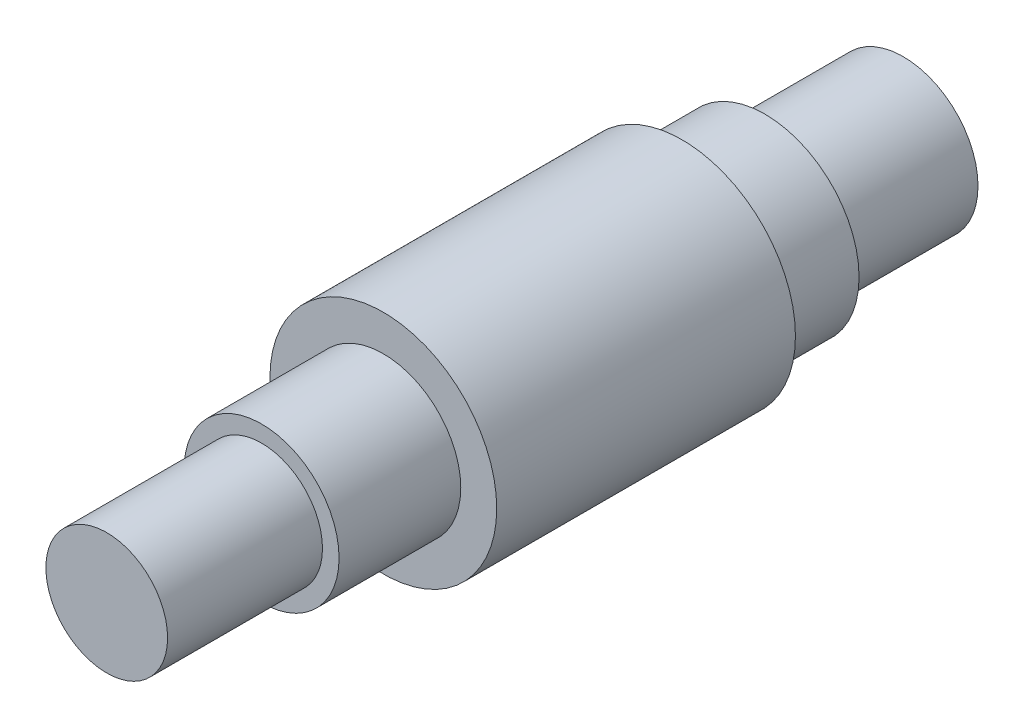
ISO-10303-21;
HEADER;
FILE_DESCRIPTION(('STEP AP214'),'2;1');
FILE_NAME('part.step','',(''),(''),'','','');
FILE_SCHEMA(('AUTOMOTIVE_DESIGN { 1 0 10303 214 1 1 1 1 }'));
ENDSEC;
DATA;
#1=APPLICATION_CONTEXT('core data for automotive mechanical design processes');
#2=APPLICATION_PROTOCOL_DEFINITION('international standard','automotive_design',2000,#1);
#3=PRODUCT_CONTEXT('',#1,'mechanical');
#4=PRODUCT('Part','Part','',(#3));
#5=PRODUCT_RELATED_PRODUCT_CATEGORY('part','',(#4));
#6=PRODUCT_DEFINITION_FORMATION('','',#4);
#7=PRODUCT_DEFINITION_CONTEXT('part definition',#1,'design');
#8=PRODUCT_DEFINITION('design','',#6,#7);
#9=PRODUCT_DEFINITION_SHAPE('','',#8);
#10=(LENGTH_UNIT() NAMED_UNIT(*) SI_UNIT(.MILLI.,.METRE.));
#11=(NAMED_UNIT(*) PLANE_ANGLE_UNIT() SI_UNIT($,.RADIAN.));
#12=(NAMED_UNIT(*) SI_UNIT($,.STERADIAN.) SOLID_ANGLE_UNIT());
#13=UNCERTAINTY_MEASURE_WITH_UNIT(LENGTH_MEASURE(1.E-05),#10,'distance_accuracy_value','');
#14=(GEOMETRIC_REPRESENTATION_CONTEXT(3) GLOBAL_UNCERTAINTY_ASSIGNED_CONTEXT((#13)) GLOBAL_UNIT_ASSIGNED_CONTEXT((#10,
#11,#12)) REPRESENTATION_CONTEXT('',''));
#15=CARTESIAN_POINT('',(0.,0.,0.));
#16=DIRECTION('',(0.,0.,1.));
#17=DIRECTION('',(1.,0.,0.));
#18=AXIS2_PLACEMENT_3D('',#15,#16,#17);
#19=CARTESIAN_POINT('',(0.,0.,-25.));
#20=DIRECTION('',(0.,0.,1.));
#21=DIRECTION('',(1.,0.,0.));
#22=AXIS2_PLACEMENT_3D('',#19,#20,#21);
#23=CYLINDRICAL_SURFACE('',#22,5.5);
#24=CARTESIAN_POINT('',(0.,0.,-14.));
#25=DIRECTION('',(0.,0.,1.));
#26=DIRECTION('',(1.,0.,0.));
#27=AXIS2_PLACEMENT_3D('',#24,#25,#26);
#28=CIRCLE('',#27,5.5);
#29=CARTESIAN_POINT('',(5.5,0.,-14.));
#30=VERTEX_POINT('',#29);
#31=EDGE_CURVE('E68',#30,#30,#28,.T.);
#32=ORIENTED_EDGE('',*,*,#31,.T.);
#33=EDGE_LOOP('',(#32));
#34=FACE_BOUND('',#33,.T.);
#35=CARTESIAN_POINT('',(0.,0.,0.));
#36=DIRECTION('',(0.,0.,1.));
#37=DIRECTION('',(1.,0.,0.));
#38=AXIS2_PLACEMENT_3D('',#35,#36,#37);
#39=CIRCLE('',#38,5.5);
#40=CARTESIAN_POINT('',(5.5,0.,0.));
#41=VERTEX_POINT('',#40);
#42=EDGE_CURVE('E71',#41,#41,#39,.T.);
#43=ORIENTED_EDGE('',*,*,#42,.F.);
#44=EDGE_LOOP('',(#43));
#45=FACE_BOUND('',#44,.T.);
#46=ADVANCED_FACE('F36',(#34,#45),#23,.T.);
#47=CARTESIAN_POINT('',(0.,0.,0.));
#48=DIRECTION('',(0.,0.,1.));
#49=DIRECTION('',(1.,0.,0.));
#50=AXIS2_PLACEMENT_3D('',#47,#48,#49);
#51=PLANE('',#50);
#52=ORIENTED_EDGE('',*,*,#42,.T.);
#53=EDGE_LOOP('',(#52));
#54=FACE_BOUND('',#53,.T.);
#55=ADVANCED_FACE('F75',(#54),#51,.T.);
#56=CARTESIAN_POINT('',(0.,0.,-72.));
#57=DIRECTION('',(0.,0.,1.));
#58=DIRECTION('',(1.,0.,0.));
#59=AXIS2_PLACEMENT_3D('',#56,#57,#58);
#60=PLANE('',#59);
#61=CARTESIAN_POINT('',(0.,0.,-72.));
#62=DIRECTION('',(0.,0.,1.));
#63=DIRECTION('',(1.,0.,0.));
#64=AXIS2_PLACEMENT_3D('',#61,#62,#63);
#65=CIRCLE('',#64,6.75);
#66=CARTESIAN_POINT('',(6.75,0.,-72.));
#67=VERTEX_POINT('',#66);
#68=EDGE_CURVE('E10',#67,#67,#65,.T.);
#69=ORIENTED_EDGE('',*,*,#68,.F.);
#70=EDGE_LOOP('',(#69));
#71=FACE_BOUND('',#70,.T.);
#72=ADVANCED_FACE('F38',(#71),#60,.F.);
#73=CARTESIAN_POINT('',(0.,0.,-25.));
#74=DIRECTION('',(0.,0.,1.));
#75=DIRECTION('',(1.,0.,0.));
#76=AXIS2_PLACEMENT_3D('',#73,#74,#75);
#77=CYLINDRICAL_SURFACE('',#76,6.75);
#78=ORIENTED_EDGE('',*,*,#68,.T.);
#79=EDGE_LOOP('',(#78));
#80=FACE_BOUND('',#79,.T.);
#81=CARTESIAN_POINT('',(0.,0.,-59.5));
#82=DIRECTION('',(0.,0.,1.));
#83=DIRECTION('',(1.,0.,0.));
#84=AXIS2_PLACEMENT_3D('',#81,#82,#83);
#85=CIRCLE('',#84,6.75);
#86=CARTESIAN_POINT('',(6.75,0.,-59.5));
#87=VERTEX_POINT('',#86);
#88=EDGE_CURVE('E43',#87,#87,#85,.T.);
#89=ORIENTED_EDGE('',*,*,#88,.F.);
#90=EDGE_LOOP('',(#89));
#91=FACE_BOUND('',#90,.T.);
#92=ADVANCED_FACE('F86',(#80,#91),#77,.T.);
#93=CARTESIAN_POINT('',(0.,0.,-59.5));
#94=DIRECTION('',(0.,0.,1.));
#95=DIRECTION('',(1.,0.,0.));
#96=AXIS2_PLACEMENT_3D('',#93,#94,#95);
#97=PLANE('',#96);
#98=CARTESIAN_POINT('',(0.,0.,-59.5));
#99=DIRECTION('',(0.,0.,1.));
#100=DIRECTION('',(1.,0.,0.));
#101=AXIS2_PLACEMENT_3D('',#98,#99,#100);
#102=CIRCLE('',#101,8.5);
#103=CARTESIAN_POINT('',(8.5,0.,-59.5));
#104=VERTEX_POINT('',#103);
#105=EDGE_CURVE('E47',#104,#104,#102,.T.);
#106=ORIENTED_EDGE('',*,*,#105,.F.);
#107=EDGE_LOOP('',(#106));
#108=FACE_BOUND('',#107,.T.);
#109=ORIENTED_EDGE('',*,*,#88,.T.);
#110=EDGE_LOOP('',(#109));
#111=FACE_BOUND('',#110,.T.);
#112=ADVANCED_FACE('F91',(#108,#111),#97,.F.);
#113=CARTESIAN_POINT('',(0.,0.,-25.));
#114=DIRECTION('',(0.,0.,1.));
#115=DIRECTION('',(1.,0.,0.));
#116=AXIS2_PLACEMENT_3D('',#113,#114,#115);
#117=CYLINDRICAL_SURFACE('',#116,8.5);
#118=ORIENTED_EDGE('',*,*,#105,.T.);
#119=EDGE_LOOP('',(#118));
#120=FACE_BOUND('',#119,.T.);
#121=CARTESIAN_POINT('',(0.,0.,-52.));
#122=DIRECTION('',(0.,0.,1.));
#123=DIRECTION('',(1.,0.,0.));
#124=AXIS2_PLACEMENT_3D('',#121,#122,#123);
#125=CIRCLE('',#124,8.5);
#126=CARTESIAN_POINT('',(8.5,0.,-52.));
#127=VERTEX_POINT('',#126);
#128=EDGE_CURVE('E51',#127,#127,#125,.T.);
#129=ORIENTED_EDGE('',*,*,#128,.F.);
#130=EDGE_LOOP('',(#129));
#131=FACE_BOUND('',#130,.T.);
#132=ADVANCED_FACE('F95',(#120,#131),#117,.T.);
#133=CARTESIAN_POINT('',(0.,0.,-52.));
#134=DIRECTION('',(0.,0.,1.));
#135=DIRECTION('',(1.,0.,0.));
#136=AXIS2_PLACEMENT_3D('',#133,#134,#135);
#137=PLANE('',#136);
#138=CARTESIAN_POINT('',(0.,0.,-52.));
#139=DIRECTION('',(0.,0.,1.));
#140=DIRECTION('',(1.,0.,0.));
#141=AXIS2_PLACEMENT_3D('',#138,#139,#140);
#142=CIRCLE('',#141,10.25);
#143=CARTESIAN_POINT('',(10.25,0.,-52.));
#144=VERTEX_POINT('',#143);
#145=EDGE_CURVE('E56',#144,#144,#142,.T.);
#146=ORIENTED_EDGE('',*,*,#145,.F.);
#147=EDGE_LOOP('',(#146));
#148=FACE_BOUND('',#147,.T.);
#149=ORIENTED_EDGE('',*,*,#128,.T.);
#150=EDGE_LOOP('',(#149));
#151=FACE_BOUND('',#150,.T.);
#152=ADVANCED_FACE('F102',(#148,#151),#137,.F.);
#153=CARTESIAN_POINT('',(0.,0.,-25.));
#154=DIRECTION('',(0.,0.,1.));
#155=DIRECTION('',(1.,0.,0.));
#156=AXIS2_PLACEMENT_3D('',#153,#154,#155);
#157=CYLINDRICAL_SURFACE('',#156,10.25);
#158=ORIENTED_EDGE('',*,*,#145,.T.);
#159=EDGE_LOOP('',(#158));
#160=FACE_BOUND('',#159,.T.);
#161=CARTESIAN_POINT('',(0.,0.,-25.));
#162=DIRECTION('',(0.,0.,1.));
#163=DIRECTION('',(1.,0.,0.));
#164=AXIS2_PLACEMENT_3D('',#161,#162,#163);
#165=CIRCLE('',#164,10.25);
#166=CARTESIAN_POINT('',(10.25,0.,-25.));
#167=VERTEX_POINT('',#166);
#168=EDGE_CURVE('E59',#167,#167,#165,.T.);
#169=ORIENTED_EDGE('',*,*,#168,.F.);
#170=EDGE_LOOP('',(#169));
#171=FACE_BOUND('',#170,.T.);
#172=ADVANCED_FACE('F106',(#160,#171),#157,.T.);
#173=CARTESIAN_POINT('',(0.,0.,-25.));
#174=DIRECTION('',(0.,0.,1.));
#175=DIRECTION('',(1.,0.,0.));
#176=AXIS2_PLACEMENT_3D('',#173,#174,#175);
#177=PLANE('',#176);
#178=ORIENTED_EDGE('',*,*,#168,.T.);
#179=EDGE_LOOP('',(#178));
#180=FACE_BOUND('',#179,.T.);
#181=CARTESIAN_POINT('',(0.,0.,-25.));
#182=DIRECTION('',(0.,0.,1.));
#183=DIRECTION('',(1.,0.,0.));
#184=AXIS2_PLACEMENT_3D('',#181,#182,#183);
#185=CIRCLE('',#184,7.);
#186=CARTESIAN_POINT('',(7.,0.,-25.));
#187=VERTEX_POINT('',#186);
#188=EDGE_CURVE('E62',#187,#187,#185,.T.);
#189=ORIENTED_EDGE('',*,*,#188,.F.);
#190=EDGE_LOOP('',(#189));
#191=FACE_BOUND('',#190,.T.);
#192=ADVANCED_FACE('F110',(#180,#191),#177,.T.);
#193=CARTESIAN_POINT('',(0.,0.,-25.));
#194=DIRECTION('',(0.,0.,1.));
#195=DIRECTION('',(1.,0.,0.));
#196=AXIS2_PLACEMENT_3D('',#193,#194,#195);
#197=CYLINDRICAL_SURFACE('',#196,7.);
#198=ORIENTED_EDGE('',*,*,#188,.T.);
#199=EDGE_LOOP('',(#198));
#200=FACE_BOUND('',#199,.T.);
#201=CARTESIAN_POINT('',(0.,0.,-14.));
#202=DIRECTION('',(0.,0.,1.));
#203=DIRECTION('',(1.,0.,0.));
#204=AXIS2_PLACEMENT_3D('',#201,#202,#203);
#205=CIRCLE('',#204,7.);
#206=CARTESIAN_POINT('',(7.,0.,-14.));
#207=VERTEX_POINT('',#206);
#208=EDGE_CURVE('E65',#207,#207,#205,.T.);
#209=ORIENTED_EDGE('',*,*,#208,.F.);
#210=EDGE_LOOP('',(#209));
#211=FACE_BOUND('',#210,.T.);
#212=ADVANCED_FACE('F114',(#200,#211),#197,.T.);
#213=CARTESIAN_POINT('',(0.,0.,-14.));
#214=DIRECTION('',(0.,0.,1.));
#215=DIRECTION('',(1.,0.,0.));
#216=AXIS2_PLACEMENT_3D('',#213,#214,#215);
#217=PLANE('',#216);
#218=ORIENTED_EDGE('',*,*,#208,.T.);
#219=EDGE_LOOP('',(#218));
#220=FACE_BOUND('',#219,.T.);
#221=ORIENTED_EDGE('',*,*,#31,.F.);
#222=EDGE_LOOP('',(#221));
#223=FACE_BOUND('',#222,.T.);
#224=ADVANCED_FACE('F117',(#220,#223),#217,.T.);
#225=CLOSED_SHELL('',(#46,#55,#72,#92,#112,#132,#152,#172,#192,#212,#224));
#226=MANIFOLD_SOLID_BREP('B2',#225);
#227=ADVANCED_BREP_SHAPE_REPRESENTATION('',(#18,#226),#14);
#228=SHAPE_DEFINITION_REPRESENTATION(#9,#227);
ENDSEC;
END-ISO-10303-21;
